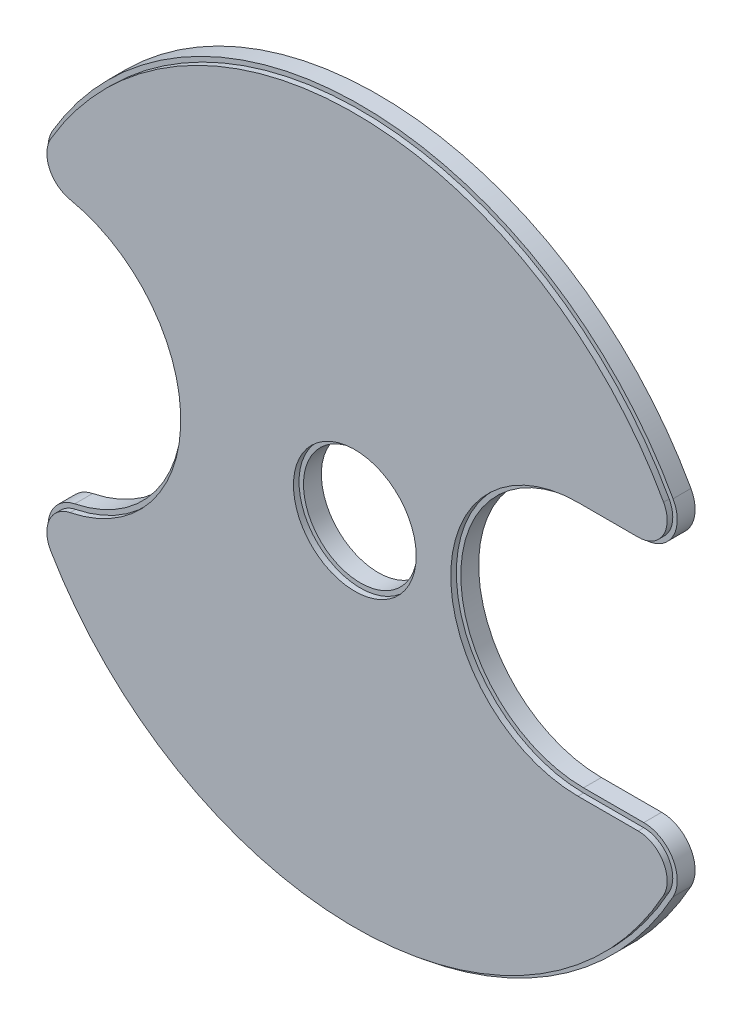
ISO-10303-21;
HEADER;
FILE_DESCRIPTION(('STEP AP214'),'2;1');
FILE_NAME('part.step','',(''),(''),'','','');
FILE_SCHEMA(('AUTOMOTIVE_DESIGN { 1 0 10303 214 1 1 1 1 }'));
ENDSEC;
DATA;
#1=APPLICATION_CONTEXT('core data for automotive mechanical design processes');
#2=APPLICATION_PROTOCOL_DEFINITION('international standard','automotive_design',2000,#1);
#3=PRODUCT_CONTEXT('',#1,'mechanical');
#4=PRODUCT('Part','Part','',(#3));
#5=PRODUCT_RELATED_PRODUCT_CATEGORY('part','',(#4));
#6=PRODUCT_DEFINITION_FORMATION('','',#4);
#7=PRODUCT_DEFINITION_CONTEXT('part definition',#1,'design');
#8=PRODUCT_DEFINITION('design','',#6,#7);
#9=PRODUCT_DEFINITION_SHAPE('','',#8);
#10=(LENGTH_UNIT() NAMED_UNIT(*) SI_UNIT(.MILLI.,.METRE.));
#11=(NAMED_UNIT(*) PLANE_ANGLE_UNIT() SI_UNIT($,.RADIAN.));
#12=(NAMED_UNIT(*) SI_UNIT($,.STERADIAN.) SOLID_ANGLE_UNIT());
#13=UNCERTAINTY_MEASURE_WITH_UNIT(LENGTH_MEASURE(1.E-05),#10,'distance_accuracy_value','');
#14=(GEOMETRIC_REPRESENTATION_CONTEXT(3) GLOBAL_UNCERTAINTY_ASSIGNED_CONTEXT((#13)) GLOBAL_UNIT_ASSIGNED_CONTEXT((#10,
#11,#12)) REPRESENTATION_CONTEXT('',''));
#15=CARTESIAN_POINT('',(0.,0.,0.));
#16=DIRECTION('',(0.,0.,1.));
#17=DIRECTION('',(1.,0.,0.));
#18=AXIS2_PLACEMENT_3D('',#15,#16,#17);
#19=CARTESIAN_POINT('',(0.,0.,1.6));
#20=DIRECTION('',(0.,0.,-1.));
#21=DIRECTION('',(-1.,0.,0.));
#22=AXIS2_PLACEMENT_3D('',#19,#20,#21);
#23=PLANE('',#22);
#24=CARTESIAN_POINT('',(0.,0.,1.6));
#25=DIRECTION('',(0.,0.,1.));
#26=DIRECTION('',(1.,0.,0.));
#27=AXIS2_PLACEMENT_3D('',#24,#25,#26);
#28=CIRCLE('',#27,5.1);
#29=CARTESIAN_POINT('',(5.1,0.,1.6));
#30=VERTEX_POINT('',#29);
#31=EDGE_CURVE('E199',#30,#30,#28,.T.);
#32=ORIENTED_EDGE('',*,*,#31,.F.);
#33=EDGE_LOOP('',(#32));
#34=FACE_BOUND('',#33,.T.);
#35=CARTESIAN_POINT('',(0.,0.,1.6));
#36=DIRECTION('',(0.,0.,1.));
#37=DIRECTION('',(1.,0.,0.));
#38=AXIS2_PLACEMENT_3D('',#35,#36,#37);
#39=CIRCLE('',#38,5.5);
#40=CARTESIAN_POINT('',(5.5,0.,1.6));
#41=VERTEX_POINT('',#40);
#42=EDGE_CURVE('E562',#41,#41,#39,.T.);
#43=ORIENTED_EDGE('',*,*,#42,.T.);
#44=EDGE_LOOP('',(#43));
#45=FACE_BOUND('',#44,.T.);
#46=ADVANCED_FACE('F39',(#34,#45),#23,.F.);
#47=CARTESIAN_POINT('',(20.,0.,1.6));
#48=DIRECTION('',(0.,0.,-1.));
#49=DIRECTION('',(1.,0.,0.));
#50=AXIS2_PLACEMENT_3D('',#47,#48,#49);
#51=CIRCLE('',#50,11.4);
#52=CARTESIAN_POINT('',(20.,-11.4,1.6));
#53=VERTEX_POINT('',#52);
#54=CARTESIAN_POINT('',(20.,11.4,1.6));
#55=VERTEX_POINT('',#54);
#56=EDGE_CURVE('E54',#53,#55,#51,.T.);
#57=ORIENTED_EDGE('',*,*,#56,.F.);
#58=DIRECTION('',(-1.,0.,0.));
#59=VECTOR('',#58,1.);
#60=CARTESIAN_POINT('',(25.3968501984006,-11.4,1.6));
#61=LINE('',#60,#59);
#62=CARTESIAN_POINT('',(25.3968501984006,-11.4,1.6));
#63=VERTEX_POINT('',#62);
#64=EDGE_CURVE('E58',#63,#53,#61,.T.);
#65=ORIENTED_EDGE('',*,*,#64,.F.);
#66=CARTESIAN_POINT('',(25.3968501984006,-14.,1.6));
#67=DIRECTION('',(0.,0.,1.));
#68=DIRECTION('',(1.,0.,0.));
#69=AXIS2_PLACEMENT_3D('',#66,#67,#68);
#70=CIRCLE('',#69,2.6);
#71=CARTESIAN_POINT('',(27.6738091817055,-15.2551724137931,1.6));
#72=VERTEX_POINT('',#71);
#73=EDGE_CURVE('E602',#72,#63,#70,.T.);
#74=ORIENTED_EDGE('',*,*,#73,.F.);
#75=CARTESIAN_POINT('',(0.,1.17961196366423E-13,1.6));
#76=DIRECTION('',(0.,0.,1.));
#77=DIRECTION('',(1.,0.,0.));
#78=AXIS2_PLACEMENT_3D('',#75,#76,#77);
#79=CIRCLE('',#78,31.6);
#80=CARTESIAN_POINT('',(-27.2413793103448,-16.0145950079893,1.6));
#81=VERTEX_POINT('',#80);
#82=EDGE_CURVE('E599',#81,#72,#79,.T.);
#83=ORIENTED_EDGE('',*,*,#82,.F.);
#84=CARTESIAN_POINT('',(-25.,-14.6969384566991,1.6));
#85=DIRECTION('',(0.,0.,1.));
#86=DIRECTION('',(1.,0.,0.));
#87=AXIS2_PLACEMENT_3D('',#84,#85,#86);
#88=CIRCLE('',#87,2.6);
#89=CARTESIAN_POINT('',(-25.52,-12.1494691242046,1.6));
#90=VERTEX_POINT('',#89);
#91=EDGE_CURVE('E596',#90,#81,#88,.T.);
#92=ORIENTED_EDGE('',*,*,#91,.F.);
#93=CARTESIAN_POINT('',(-28.,0.,1.6));
#94=DIRECTION('',(0.,0.,-1.));
#95=DIRECTION('',(1.,0.,0.));
#96=AXIS2_PLACEMENT_3D('',#93,#94,#95);
#97=CIRCLE('',#96,12.4);
#98=CARTESIAN_POINT('',(-25.52,12.1494691242046,1.6));
#99=VERTEX_POINT('',#98);
#100=EDGE_CURVE('E593',#99,#90,#97,.T.);
#101=ORIENTED_EDGE('',*,*,#100,.F.);
#102=CARTESIAN_POINT('',(-25.,14.6969384566991,1.6));
#103=DIRECTION('',(0.,0.,1.));
#104=DIRECTION('',(1.,0.,0.));
#105=AXIS2_PLACEMENT_3D('',#102,#103,#104);
#106=CIRCLE('',#105,2.6);
#107=CARTESIAN_POINT('',(-27.2413793103448,16.0145950079893,1.6));
#108=VERTEX_POINT('',#107);
#109=EDGE_CURVE('E590',#108,#99,#106,.T.);
#110=ORIENTED_EDGE('',*,*,#109,.F.);
#111=CARTESIAN_POINT('',(0.,0.,1.6));
#112=DIRECTION('',(0.,0.,1.));
#113=DIRECTION('',(1.,0.,0.));
#114=AXIS2_PLACEMENT_3D('',#111,#112,#113);
#115=CIRCLE('',#114,31.6);
#116=CARTESIAN_POINT('',(27.6738091817055,15.2551724137931,1.6));
#117=VERTEX_POINT('',#116);
#118=EDGE_CURVE('E587',#117,#108,#115,.T.);
#119=ORIENTED_EDGE('',*,*,#118,.F.);
#120=CARTESIAN_POINT('',(25.3968501984006,14.,1.6));
#121=DIRECTION('',(0.,0.,1.));
#122=DIRECTION('',(1.,0.,0.));
#123=AXIS2_PLACEMENT_3D('',#120,#121,#122);
#124=CIRCLE('',#123,2.6);
#125=CARTESIAN_POINT('',(25.3968501984006,11.4,1.6));
#126=VERTEX_POINT('',#125);
#127=EDGE_CURVE('E584',#126,#117,#124,.T.);
#128=ORIENTED_EDGE('',*,*,#127,.F.);
#129=DIRECTION('',(1.,0.,0.));
#130=VECTOR('',#129,1.);
#131=CARTESIAN_POINT('',(20.,11.4,1.6));
#132=LINE('',#131,#130);
#133=EDGE_CURVE('E582',#55,#126,#132,.T.);
#134=ORIENTED_EDGE('',*,*,#133,.F.);
#135=EDGE_LOOP('',(#57,#65,#74,#83,#92,#101,#110,#119,#128,#134));
#136=FACE_BOUND('',#135,.T.);
#137=CARTESIAN_POINT('',(-28.,0.,1.6));
#138=DIRECTION('',(0.,0.,-1.));
#139=DIRECTION('',(-1.,0.,0.));
#140=AXIS2_PLACEMENT_3D('',#137,#138,#139);
#141=CIRCLE('',#140,12.);
#142=CARTESIAN_POINT('',(-25.6,11.7575507653592,1.6));
#143=VERTEX_POINT('',#142);
#144=CARTESIAN_POINT('',(-25.6,-11.7575507653592,1.6));
#145=VERTEX_POINT('',#144);
#146=EDGE_CURVE('E211',#143,#145,#141,.T.);
#147=ORIENTED_EDGE('',*,*,#146,.T.);
#148=CARTESIAN_POINT('',(-25.,-14.6969384566991,1.6));
#149=DIRECTION('',(0.,0.,-1.));
#150=DIRECTION('',(-1.,0.,0.));
#151=AXIS2_PLACEMENT_3D('',#148,#149,#150);
#152=CIRCLE('',#151,3.);
#153=CARTESIAN_POINT('',(-27.5862068965517,-16.2173114004955,1.6));
#154=VERTEX_POINT('',#153);
#155=EDGE_CURVE('E269',#145,#154,#152,.F.);
#156=ORIENTED_EDGE('',*,*,#155,.T.);
#157=CARTESIAN_POINT('',(0.,1.17961196366423E-13,1.6));
#158=DIRECTION('',(0.,0.,1.));
#159=DIRECTION('',(1.,0.,0.));
#160=AXIS2_PLACEMENT_3D('',#157,#158,#159);
#161=CIRCLE('',#160,32.);
#162=CARTESIAN_POINT('',(28.0241105637524,-15.448275862069,1.6));
#163=VERTEX_POINT('',#162);
#164=EDGE_CURVE('E215',#154,#163,#161,.T.);
#165=ORIENTED_EDGE('',*,*,#164,.T.);
#166=CARTESIAN_POINT('',(25.3968501984006,-14.,1.6));
#167=DIRECTION('',(0.,0.,-1.));
#168=DIRECTION('',(-1.,0.,0.));
#169=AXIS2_PLACEMENT_3D('',#166,#167,#168);
#170=CIRCLE('',#169,3.);
#171=CARTESIAN_POINT('',(25.3968501984006,-11.,1.6));
#172=VERTEX_POINT('',#171);
#173=EDGE_CURVE('E265',#163,#172,#170,.F.);
#174=ORIENTED_EDGE('',*,*,#173,.T.);
#175=DIRECTION('',(-1.,0.,0.));
#176=VECTOR('',#175,1.);
#177=CARTESIAN_POINT('',(30.0499584026334,-11.,1.6));
#178=LINE('',#177,#176);
#179=CARTESIAN_POINT('',(20.,-11.,1.6));
#180=VERTEX_POINT('',#179);
#181=EDGE_CURVE('E218',#172,#180,#178,.T.);
#182=ORIENTED_EDGE('',*,*,#181,.T.);
#183=CARTESIAN_POINT('',(20.,0.,1.6));
#184=DIRECTION('',(0.,0.,-1.));
#185=DIRECTION('',(1.,0.,0.));
#186=AXIS2_PLACEMENT_3D('',#183,#184,#185);
#187=CIRCLE('',#186,11.);
#188=CARTESIAN_POINT('',(20.,11.,1.6));
#189=VERTEX_POINT('',#188);
#190=EDGE_CURVE('E220',#180,#189,#187,.T.);
#191=ORIENTED_EDGE('',*,*,#190,.T.);
#192=DIRECTION('',(1.,0.,0.));
#193=VECTOR('',#192,1.);
#194=CARTESIAN_POINT('',(30.0499584026334,11.,1.6));
#195=LINE('',#194,#193);
#196=CARTESIAN_POINT('',(25.3968501984006,11.,1.6));
#197=VERTEX_POINT('',#196);
#198=EDGE_CURVE('E222',#189,#197,#195,.T.);
#199=ORIENTED_EDGE('',*,*,#198,.T.);
#200=CARTESIAN_POINT('',(25.3968501984006,14.,1.6));
#201=DIRECTION('',(0.,0.,-1.));
#202=DIRECTION('',(-1.,0.,0.));
#203=AXIS2_PLACEMENT_3D('',#200,#201,#202);
#204=CIRCLE('',#203,3.);
#205=CARTESIAN_POINT('',(28.0241105637524,15.448275862069,1.6));
#206=VERTEX_POINT('',#205);
#207=EDGE_CURVE('E263',#197,#206,#204,.F.);
#208=ORIENTED_EDGE('',*,*,#207,.T.);
#209=CARTESIAN_POINT('',(0.,0.,1.6));
#210=DIRECTION('',(0.,0.,1.));
#211=DIRECTION('',(-1.,0.,0.));
#212=AXIS2_PLACEMENT_3D('',#209,#210,#211);
#213=CIRCLE('',#212,32.);
#214=CARTESIAN_POINT('',(-27.5862068965517,16.2173114004955,1.6));
#215=VERTEX_POINT('',#214);
#216=EDGE_CURVE('E208',#206,#215,#213,.T.);
#217=ORIENTED_EDGE('',*,*,#216,.T.);
#218=CARTESIAN_POINT('',(-25.,14.6969384566991,1.6));
#219=DIRECTION('',(0.,0.,-1.));
#220=DIRECTION('',(-1.,0.,0.));
#221=AXIS2_PLACEMENT_3D('',#218,#219,#220);
#222=CIRCLE('',#221,3.);
#223=EDGE_CURVE('E267',#215,#143,#222,.F.);
#224=ORIENTED_EDGE('',*,*,#223,.T.);
#225=EDGE_LOOP('',(#147,#156,#165,#174,#182,#191,#199,#208,#217,#224));
#226=FACE_BOUND('',#225,.T.);
#227=ADVANCED_FACE('F300',(#136,#226),#23,.F.);
#228=CARTESIAN_POINT('',(0.,0.,0.));
#229=DIRECTION('',(0.,0.,-1.));
#230=DIRECTION('',(-1.,0.,0.));
#231=AXIS2_PLACEMENT_3D('',#228,#229,#230);
#232=PLANE('',#231);
#233=CARTESIAN_POINT('',(0.,1.17961196366423E-13,0.));
#234=DIRECTION('',(0.,0.,1.));
#235=DIRECTION('',(1.,0.,0.));
#236=AXIS2_PLACEMENT_3D('',#233,#234,#235);
#237=CIRCLE('',#236,32.);
#238=CARTESIAN_POINT('',(-27.5862068965517,-16.2173114004955,0.));
#239=VERTEX_POINT('',#238);
#240=CARTESIAN_POINT('',(28.0241105637524,-15.448275862069,0.));
#241=VERTEX_POINT('',#240);
#242=EDGE_CURVE('E231',#239,#241,#237,.T.);
#243=ORIENTED_EDGE('',*,*,#242,.F.);
#244=CARTESIAN_POINT('',(-25.,-14.6969384566991,0.));
#245=DIRECTION('',(0.,0.,-1.));
#246=DIRECTION('',(-1.,0.,0.));
#247=AXIS2_PLACEMENT_3D('',#244,#245,#246);
#248=CIRCLE('',#247,3.);
#249=CARTESIAN_POINT('',(-25.6,-11.7575507653592,0.));
#250=VERTEX_POINT('',#249);
#251=EDGE_CURVE('E256',#239,#250,#248,.T.);
#252=ORIENTED_EDGE('',*,*,#251,.T.);
#253=CARTESIAN_POINT('',(-28.,0.,0.));
#254=DIRECTION('',(0.,0.,-1.));
#255=DIRECTION('',(-1.,0.,0.));
#256=AXIS2_PLACEMENT_3D('',#253,#254,#255);
#257=CIRCLE('',#256,12.);
#258=CARTESIAN_POINT('',(-25.6,11.7575507653592,0.));
#259=VERTEX_POINT('',#258);
#260=EDGE_CURVE('E228',#259,#250,#257,.T.);
#261=ORIENTED_EDGE('',*,*,#260,.F.);
#262=CARTESIAN_POINT('',(-25.,14.6969384566991,0.));
#263=DIRECTION('',(0.,0.,-1.));
#264=DIRECTION('',(-1.,0.,0.));
#265=AXIS2_PLACEMENT_3D('',#262,#263,#264);
#266=CIRCLE('',#265,3.);
#267=CARTESIAN_POINT('',(-27.5862068965517,16.2173114004955,0.));
#268=VERTEX_POINT('',#267);
#269=EDGE_CURVE('E254',#259,#268,#266,.T.);
#270=ORIENTED_EDGE('',*,*,#269,.T.);
#271=CARTESIAN_POINT('',(0.,0.,0.));
#272=DIRECTION('',(0.,0.,1.));
#273=DIRECTION('',(-1.,0.,0.));
#274=AXIS2_PLACEMENT_3D('',#271,#272,#273);
#275=CIRCLE('',#274,32.);
#276=CARTESIAN_POINT('',(28.0241105637524,15.448275862069,0.));
#277=VERTEX_POINT('',#276);
#278=EDGE_CURVE('E206',#277,#268,#275,.T.);
#279=ORIENTED_EDGE('',*,*,#278,.F.);
#280=CARTESIAN_POINT('',(25.3968501984006,14.,0.));
#281=DIRECTION('',(0.,0.,-1.));
#282=DIRECTION('',(-1.,0.,0.));
#283=AXIS2_PLACEMENT_3D('',#280,#281,#282);
#284=CIRCLE('',#283,3.);
#285=CARTESIAN_POINT('',(25.3968501984006,11.,0.));
#286=VERTEX_POINT('',#285);
#287=EDGE_CURVE('E250',#277,#286,#284,.T.);
#288=ORIENTED_EDGE('',*,*,#287,.T.);
#289=DIRECTION('',(1.,0.,0.));
#290=VECTOR('',#289,1.);
#291=CARTESIAN_POINT('',(30.0499584026334,11.,0.));
#292=LINE('',#291,#290);
#293=CARTESIAN_POINT('',(20.,11.,0.));
#294=VERTEX_POINT('',#293);
#295=EDGE_CURVE('E212',#294,#286,#292,.T.);
#296=ORIENTED_EDGE('',*,*,#295,.F.);
#297=CARTESIAN_POINT('',(20.,0.,0.));
#298=DIRECTION('',(0.,0.,-1.));
#299=DIRECTION('',(1.,0.,0.));
#300=AXIS2_PLACEMENT_3D('',#297,#298,#299);
#301=CIRCLE('',#300,11.);
#302=CARTESIAN_POINT('',(20.,-11.,0.));
#303=VERTEX_POINT('',#302);
#304=EDGE_CURVE('E236',#303,#294,#301,.T.);
#305=ORIENTED_EDGE('',*,*,#304,.F.);
#306=DIRECTION('',(-1.,0.,0.));
#307=VECTOR('',#306,1.);
#308=CARTESIAN_POINT('',(30.0499584026334,-11.,0.));
#309=LINE('',#308,#307);
#310=CARTESIAN_POINT('',(25.3968501984006,-11.,0.));
#311=VERTEX_POINT('',#310);
#312=EDGE_CURVE('E234',#311,#303,#309,.T.);
#313=ORIENTED_EDGE('',*,*,#312,.F.);
#314=CARTESIAN_POINT('',(25.3968501984006,-14.,0.));
#315=DIRECTION('',(0.,0.,-1.));
#316=DIRECTION('',(-1.,0.,0.));
#317=AXIS2_PLACEMENT_3D('',#314,#315,#316);
#318=CIRCLE('',#317,3.);
#319=EDGE_CURVE('E252',#311,#241,#318,.T.);
#320=ORIENTED_EDGE('',*,*,#319,.T.);
#321=EDGE_LOOP('',(#243,#252,#261,#270,#279,#288,#296,#305,#313,#320));
#322=FACE_BOUND('',#321,.T.);
#323=CARTESIAN_POINT('',(0.,0.,0.));
#324=DIRECTION('',(0.,0.,1.));
#325=DIRECTION('',(1.,0.,0.));
#326=AXIS2_PLACEMENT_3D('',#323,#324,#325);
#327=CIRCLE('',#326,5.1);
#328=CARTESIAN_POINT('',(5.1,0.,0.));
#329=VERTEX_POINT('',#328);
#330=EDGE_CURVE('E196',#329,#329,#327,.T.);
#331=ORIENTED_EDGE('',*,*,#330,.T.);
#332=EDGE_LOOP('',(#331));
#333=FACE_BOUND('',#332,.T.);
#334=ADVANCED_FACE('F287',(#322,#333),#232,.T.);
#335=CARTESIAN_POINT('',(0.,0.,1.6));
#336=DIRECTION('',(0.,0.,-1.));
#337=DIRECTION('',(-1.,0.,0.));
#338=AXIS2_PLACEMENT_3D('',#335,#336,#337);
#339=CYLINDRICAL_SURFACE('',#338,32.);
#340=ORIENTED_EDGE('',*,*,#278,.T.);
#341=DIRECTION('',(0.,0.,-1.));
#342=VECTOR('',#341,1.);
#343=CARTESIAN_POINT('',(-27.5862068965517,16.2173114004955,1.6));
#344=LINE('',#343,#342);
#345=EDGE_CURVE('E274',#268,#215,#344,.F.);
#346=ORIENTED_EDGE('',*,*,#345,.T.);
#347=ORIENTED_EDGE('',*,*,#216,.F.);
#348=DIRECTION('',(0.,0.,-1.));
#349=VECTOR('',#348,1.);
#350=CARTESIAN_POINT('',(28.0241105637524,15.448275862069,1.6));
#351=LINE('',#350,#349);
#352=EDGE_CURVE('E271',#206,#277,#351,.T.);
#353=ORIENTED_EDGE('',*,*,#352,.T.);
#354=EDGE_LOOP('',(#340,#346,#347,#353));
#355=FACE_BOUND('',#354,.T.);
#356=ADVANCED_FACE('F306',(#355),#339,.T.);
#357=CARTESIAN_POINT('',(-28.,0.,1.6));
#358=DIRECTION('',(0.,0.,-1.));
#359=DIRECTION('',(-1.,0.,0.));
#360=AXIS2_PLACEMENT_3D('',#357,#358,#359);
#361=CYLINDRICAL_SURFACE('',#360,12.);
#362=ORIENTED_EDGE('',*,*,#260,.T.);
#363=DIRECTION('',(0.,0.,-1.));
#364=VECTOR('',#363,1.);
#365=CARTESIAN_POINT('',(-25.6,-11.7575507653592,1.6));
#366=LINE('',#365,#364);
#367=EDGE_CURVE('E261',#250,#145,#366,.F.);
#368=ORIENTED_EDGE('',*,*,#367,.T.);
#369=ORIENTED_EDGE('',*,*,#146,.F.);
#370=DIRECTION('',(0.,0.,-1.));
#371=VECTOR('',#370,1.);
#372=CARTESIAN_POINT('',(-25.6,11.7575507653592,1.6));
#373=LINE('',#372,#371);
#374=EDGE_CURVE('E258',#143,#259,#373,.T.);
#375=ORIENTED_EDGE('',*,*,#374,.T.);
#376=EDGE_LOOP('',(#362,#368,#369,#375));
#377=FACE_BOUND('',#376,.T.);
#378=ADVANCED_FACE('F315',(#377),#361,.F.);
#379=CARTESIAN_POINT('',(0.,1.17961196366423E-13,1.6));
#380=DIRECTION('',(0.,0.,-1.));
#381=DIRECTION('',(-1.,0.,0.));
#382=AXIS2_PLACEMENT_3D('',#379,#380,#381);
#383=CYLINDRICAL_SURFACE('',#382,32.);
#384=ORIENTED_EDGE('',*,*,#164,.F.);
#385=DIRECTION('',(0.,0.,-1.));
#386=VECTOR('',#385,1.);
#387=CARTESIAN_POINT('',(-27.5862068965517,-16.2173114004955,1.6));
#388=LINE('',#387,#386);
#389=EDGE_CURVE('E247',#154,#239,#388,.T.);
#390=ORIENTED_EDGE('',*,*,#389,.T.);
#391=ORIENTED_EDGE('',*,*,#242,.T.);
#392=DIRECTION('',(0.,0.,-1.));
#393=VECTOR('',#392,1.);
#394=CARTESIAN_POINT('',(28.0241105637524,-15.448275862069,1.6));
#395=LINE('',#394,#393);
#396=EDGE_CURVE('E245',#241,#163,#395,.F.);
#397=ORIENTED_EDGE('',*,*,#396,.T.);
#398=EDGE_LOOP('',(#384,#390,#391,#397));
#399=FACE_BOUND('',#398,.T.);
#400=ADVANCED_FACE('F323',(#399),#383,.T.);
#401=CARTESIAN_POINT('',(30.0499584026334,-11.,1.6));
#402=DIRECTION('',(0.,-1.,0.));
#403=DIRECTION('',(1.,0.,0.));
#404=AXIS2_PLACEMENT_3D('',#401,#402,#403);
#405=PLANE('',#404);
#406=ORIENTED_EDGE('',*,*,#181,.F.);
#407=DIRECTION('',(0.,0.,-1.));
#408=VECTOR('',#407,1.);
#409=CARTESIAN_POINT('',(25.3968501984006,-11.,1.6));
#410=LINE('',#409,#408);
#411=EDGE_CURVE('E47',#172,#311,#410,.T.);
#412=ORIENTED_EDGE('',*,*,#411,.T.);
#413=ORIENTED_EDGE('',*,*,#312,.T.);
#414=DIRECTION('',(0.,0.,-1.));
#415=VECTOR('',#414,1.);
#416=CARTESIAN_POINT('',(20.,-11.,1.6));
#417=LINE('',#416,#415);
#418=EDGE_CURVE('E242',#180,#303,#417,.T.);
#419=ORIENTED_EDGE('',*,*,#418,.F.);
#420=EDGE_LOOP('',(#406,#412,#413,#419));
#421=FACE_BOUND('',#420,.T.);
#422=ADVANCED_FACE('F280',(#421),#405,.F.);
#423=CARTESIAN_POINT('',(20.,0.,1.6));
#424=DIRECTION('',(0.,0.,-1.));
#425=DIRECTION('',(-1.,0.,0.));
#426=AXIS2_PLACEMENT_3D('',#423,#424,#425);
#427=CYLINDRICAL_SURFACE('',#426,11.);
#428=ORIENTED_EDGE('',*,*,#304,.T.);
#429=DIRECTION('',(0.,0.,-1.));
#430=VECTOR('',#429,1.);
#431=CARTESIAN_POINT('',(20.,11.,1.6));
#432=LINE('',#431,#430);
#433=EDGE_CURVE('E225',#189,#294,#432,.T.);
#434=ORIENTED_EDGE('',*,*,#433,.F.);
#435=ORIENTED_EDGE('',*,*,#190,.F.);
#436=ORIENTED_EDGE('',*,*,#418,.T.);
#437=EDGE_LOOP('',(#428,#434,#435,#436));
#438=FACE_BOUND('',#437,.T.);
#439=ADVANCED_FACE('F292',(#438),#427,.F.);
#440=CARTESIAN_POINT('',(30.0499584026334,11.,1.6));
#441=DIRECTION('',(0.,1.,0.));
#442=DIRECTION('',(-1.,0.,0.));
#443=AXIS2_PLACEMENT_3D('',#440,#441,#442);
#444=PLANE('',#443);
#445=ORIENTED_EDGE('',*,*,#295,.T.);
#446=DIRECTION('',(0.,0.,-1.));
#447=VECTOR('',#446,1.);
#448=CARTESIAN_POINT('',(25.3968501984006,11.,1.6));
#449=LINE('',#448,#447);
#450=EDGE_CURVE('E11',#286,#197,#449,.F.);
#451=ORIENTED_EDGE('',*,*,#450,.T.);
#452=ORIENTED_EDGE('',*,*,#198,.F.);
#453=ORIENTED_EDGE('',*,*,#433,.T.);
#454=EDGE_LOOP('',(#445,#451,#452,#453));
#455=FACE_BOUND('',#454,.T.);
#456=ADVANCED_FACE('F296',(#455),#444,.F.);
#457=CARTESIAN_POINT('',(0.,0.,1.6));
#458=DIRECTION('',(0.,0.,-1.));
#459=DIRECTION('',(-1.,0.,0.));
#460=AXIS2_PLACEMENT_3D('',#457,#458,#459);
#461=CYLINDRICAL_SURFACE('',#460,5.1);
#462=ORIENTED_EDGE('',*,*,#31,.T.);
#463=EDGE_LOOP('',(#462));
#464=FACE_BOUND('',#463,.T.);
#465=ORIENTED_EDGE('',*,*,#330,.F.);
#466=EDGE_LOOP('',(#465));
#467=FACE_BOUND('',#466,.T.);
#468=ADVANCED_FACE('F342',(#464,#467),#461,.F.);
#469=CARTESIAN_POINT('',(-25.,-14.6969384566991,1.6));
#470=DIRECTION('',(0.,0.,1.));
#471=DIRECTION('',(1.,0.,0.));
#472=AXIS2_PLACEMENT_3D('',#469,#470,#471);
#473=CYLINDRICAL_SURFACE('',#472,3.);
#474=ORIENTED_EDGE('',*,*,#155,.F.);
#475=ORIENTED_EDGE('',*,*,#367,.F.);
#476=ORIENTED_EDGE('',*,*,#251,.F.);
#477=ORIENTED_EDGE('',*,*,#389,.F.);
#478=EDGE_LOOP('',(#474,#475,#476,#477));
#479=FACE_BOUND('',#478,.T.);
#480=ADVANCED_FACE('F321',(#479),#473,.T.);
#481=CARTESIAN_POINT('',(-25.,14.6969384566991,1.6));
#482=DIRECTION('',(0.,0.,1.));
#483=DIRECTION('',(1.,0.,0.));
#484=AXIS2_PLACEMENT_3D('',#481,#482,#483);
#485=CYLINDRICAL_SURFACE('',#484,3.);
#486=ORIENTED_EDGE('',*,*,#223,.F.);
#487=ORIENTED_EDGE('',*,*,#345,.F.);
#488=ORIENTED_EDGE('',*,*,#269,.F.);
#489=ORIENTED_EDGE('',*,*,#374,.F.);
#490=EDGE_LOOP('',(#486,#487,#488,#489));
#491=FACE_BOUND('',#490,.T.);
#492=ADVANCED_FACE('F312',(#491),#485,.T.);
#493=CARTESIAN_POINT('',(25.3968501984006,-14.,1.6));
#494=DIRECTION('',(0.,0.,-1.));
#495=DIRECTION('',(-1.,0.,0.));
#496=AXIS2_PLACEMENT_3D('',#493,#494,#495);
#497=CYLINDRICAL_SURFACE('',#496,3.);
#498=ORIENTED_EDGE('',*,*,#173,.F.);
#499=ORIENTED_EDGE('',*,*,#396,.F.);
#500=ORIENTED_EDGE('',*,*,#319,.F.);
#501=ORIENTED_EDGE('',*,*,#411,.F.);
#502=EDGE_LOOP('',(#498,#499,#500,#501));
#503=FACE_BOUND('',#502,.T.);
#504=ADVANCED_FACE('F325',(#503),#497,.T.);
#505=CARTESIAN_POINT('',(25.3968501984006,14.,1.6));
#506=DIRECTION('',(0.,0.,-1.));
#507=DIRECTION('',(-1.,0.,0.));
#508=AXIS2_PLACEMENT_3D('',#505,#506,#507);
#509=CYLINDRICAL_SURFACE('',#508,3.);
#510=ORIENTED_EDGE('',*,*,#207,.F.);
#511=ORIENTED_EDGE('',*,*,#450,.F.);
#512=ORIENTED_EDGE('',*,*,#287,.F.);
#513=ORIENTED_EDGE('',*,*,#352,.F.);
#514=EDGE_LOOP('',(#510,#511,#512,#513));
#515=FACE_BOUND('',#514,.T.);
#516=ADVANCED_FACE('F41',(#515),#509,.T.);
#517=CARTESIAN_POINT('',(20.,0.,2.1));
#518=DIRECTION('',(0.,0.,1.));
#519=DIRECTION('',(1.,0.,0.));
#520=AXIS2_PLACEMENT_3D('',#517,#518,#519);
#521=PLANE('',#520);
#522=CARTESIAN_POINT('',(20.,0.,2.1));
#523=DIRECTION('',(0.,0.,-1.));
#524=DIRECTION('',(1.,0.,0.));
#525=AXIS2_PLACEMENT_3D('',#522,#523,#524);
#526=CIRCLE('',#525,11.4);
#527=CARTESIAN_POINT('',(20.,-11.4,2.1));
#528=VERTEX_POINT('',#527);
#529=CARTESIAN_POINT('',(20.,11.4,2.1));
#530=VERTEX_POINT('',#529);
#531=EDGE_CURVE('E184',#528,#530,#526,.T.);
#532=ORIENTED_EDGE('',*,*,#531,.T.);
#533=DIRECTION('',(1.,0.,0.));
#534=VECTOR('',#533,1.);
#535=CARTESIAN_POINT('',(20.,11.4,2.1));
#536=LINE('',#535,#534);
#537=CARTESIAN_POINT('',(25.3968501984006,11.4,2.1));
#538=VERTEX_POINT('',#537);
#539=EDGE_CURVE('E173',#530,#538,#536,.T.);
#540=ORIENTED_EDGE('',*,*,#539,.T.);
#541=CARTESIAN_POINT('',(25.3968501984006,14.,2.1));
#542=DIRECTION('',(0.,0.,1.));
#543=DIRECTION('',(1.,0.,0.));
#544=AXIS2_PLACEMENT_3D('',#541,#542,#543);
#545=CIRCLE('',#544,2.6);
#546=CARTESIAN_POINT('',(27.6738091817055,15.2551724137931,2.1));
#547=VERTEX_POINT('',#546);
#548=EDGE_CURVE('E183',#538,#547,#545,.T.);
#549=ORIENTED_EDGE('',*,*,#548,.T.);
#550=CARTESIAN_POINT('',(0.,0.,2.1));
#551=DIRECTION('',(0.,0.,1.));
#552=DIRECTION('',(1.,0.,0.));
#553=AXIS2_PLACEMENT_3D('',#550,#551,#552);
#554=CIRCLE('',#553,31.6);
#555=CARTESIAN_POINT('',(-27.2413793103448,16.0145950079893,2.1));
#556=VERTEX_POINT('',#555);
#557=EDGE_CURVE('E567',#547,#556,#554,.T.);
#558=ORIENTED_EDGE('',*,*,#557,.T.);
#559=CARTESIAN_POINT('',(-25.,14.6969384566991,2.1));
#560=DIRECTION('',(0.,0.,1.));
#561=DIRECTION('',(1.,0.,0.));
#562=AXIS2_PLACEMENT_3D('',#559,#560,#561);
#563=CIRCLE('',#562,2.6);
#564=CARTESIAN_POINT('',(-25.52,12.1494691242046,2.1));
#565=VERTEX_POINT('',#564);
#566=EDGE_CURVE('E569',#556,#565,#563,.T.);
#567=ORIENTED_EDGE('',*,*,#566,.T.);
#568=CARTESIAN_POINT('',(-28.,0.,2.1));
#569=DIRECTION('',(0.,0.,-1.));
#570=DIRECTION('',(1.,0.,0.));
#571=AXIS2_PLACEMENT_3D('',#568,#569,#570);
#572=CIRCLE('',#571,12.4);
#573=CARTESIAN_POINT('',(-25.52,-12.1494691242046,2.1));
#574=VERTEX_POINT('',#573);
#575=EDGE_CURVE('E571',#565,#574,#572,.T.);
#576=ORIENTED_EDGE('',*,*,#575,.T.);
#577=CARTESIAN_POINT('',(-25.,-14.6969384566991,2.1));
#578=DIRECTION('',(0.,0.,1.));
#579=DIRECTION('',(1.,0.,0.));
#580=AXIS2_PLACEMENT_3D('',#577,#578,#579);
#581=CIRCLE('',#580,2.6);
#582=CARTESIAN_POINT('',(-27.2413793103448,-16.0145950079893,2.1));
#583=VERTEX_POINT('',#582);
#584=EDGE_CURVE('E573',#574,#583,#581,.T.);
#585=ORIENTED_EDGE('',*,*,#584,.T.);
#586=CARTESIAN_POINT('',(0.,1.17961196366423E-13,2.1));
#587=DIRECTION('',(0.,0.,1.));
#588=DIRECTION('',(1.,0.,0.));
#589=AXIS2_PLACEMENT_3D('',#586,#587,#588);
#590=CIRCLE('',#589,31.6);
#591=CARTESIAN_POINT('',(27.6738091817055,-15.2551724137931,2.1));
#592=VERTEX_POINT('',#591);
#593=EDGE_CURVE('E575',#583,#592,#590,.T.);
#594=ORIENTED_EDGE('',*,*,#593,.T.);
#595=CARTESIAN_POINT('',(25.3968501984006,-14.,2.1));
#596=DIRECTION('',(0.,0.,1.));
#597=DIRECTION('',(1.,0.,0.));
#598=AXIS2_PLACEMENT_3D('',#595,#596,#597);
#599=CIRCLE('',#598,2.6);
#600=CARTESIAN_POINT('',(25.3968501984006,-11.4,2.1));
#601=VERTEX_POINT('',#600);
#602=EDGE_CURVE('E577',#592,#601,#599,.T.);
#603=ORIENTED_EDGE('',*,*,#602,.T.);
#604=DIRECTION('',(-1.,0.,0.));
#605=VECTOR('',#604,1.);
#606=CARTESIAN_POINT('',(25.3968501984006,-11.4,2.1));
#607=LINE('',#606,#605);
#608=EDGE_CURVE('E190',#601,#528,#607,.T.);
#609=ORIENTED_EDGE('',*,*,#608,.T.);
#610=EDGE_LOOP('',(#532,#540,#549,#558,#567,#576,#585,#594,#603,#609));
#611=FACE_BOUND('',#610,.T.);
#612=CARTESIAN_POINT('',(0.,0.,2.1));
#613=DIRECTION('',(0.,0.,1.));
#614=DIRECTION('',(1.,0.,0.));
#615=AXIS2_PLACEMENT_3D('',#612,#613,#614);
#616=CIRCLE('',#615,5.5);
#617=CARTESIAN_POINT('',(5.5,0.,2.1));
#618=VERTEX_POINT('',#617);
#619=EDGE_CURVE('E559',#618,#618,#616,.T.);
#620=ORIENTED_EDGE('',*,*,#619,.F.);
#621=EDGE_LOOP('',(#620));
#622=FACE_BOUND('',#621,.T.);
#623=ADVANCED_FACE('F187',(#611,#622),#521,.T.);
#624=CARTESIAN_POINT('',(20.,0.,2.1));
#625=DIRECTION('',(0.,0.,-1.));
#626=DIRECTION('',(-1.,0.,0.));
#627=AXIS2_PLACEMENT_3D('',#624,#625,#626);
#628=CYLINDRICAL_SURFACE('',#627,11.4);
#629=ORIENTED_EDGE('',*,*,#56,.T.);
#630=DIRECTION('',(0.,0.,-1.));
#631=VECTOR('',#630,1.);
#632=CARTESIAN_POINT('',(20.,11.4,2.1));
#633=LINE('',#632,#631);
#634=EDGE_CURVE('E178',#530,#55,#633,.T.);
#635=ORIENTED_EDGE('',*,*,#634,.F.);
#636=ORIENTED_EDGE('',*,*,#531,.F.);
#637=DIRECTION('',(0.,0.,-1.));
#638=VECTOR('',#637,1.);
#639=CARTESIAN_POINT('',(20.,-11.4,2.1));
#640=LINE('',#639,#638);
#641=EDGE_CURVE('E580',#528,#53,#640,.T.);
#642=ORIENTED_EDGE('',*,*,#641,.T.);
#643=EDGE_LOOP('',(#629,#635,#636,#642));
#644=FACE_BOUND('',#643,.T.);
#645=ADVANCED_FACE('F195',(#644),#628,.F.);
#646=CARTESIAN_POINT('',(20.,11.4,2.1));
#647=DIRECTION('',(0.,1.,0.));
#648=DIRECTION('',(-1.,0.,0.));
#649=AXIS2_PLACEMENT_3D('',#646,#647,#648);
#650=PLANE('',#649);
#651=ORIENTED_EDGE('',*,*,#133,.T.);
#652=DIRECTION('',(0.,0.,-1.));
#653=VECTOR('',#652,1.);
#654=CARTESIAN_POINT('',(25.3968501984006,11.4,2.1));
#655=LINE('',#654,#653);
#656=EDGE_CURVE('E180',#538,#126,#655,.T.);
#657=ORIENTED_EDGE('',*,*,#656,.F.);
#658=ORIENTED_EDGE('',*,*,#539,.F.);
#659=ORIENTED_EDGE('',*,*,#634,.T.);
#660=EDGE_LOOP('',(#651,#657,#658,#659));
#661=FACE_BOUND('',#660,.T.);
#662=ADVANCED_FACE('F176',(#661),#650,.F.);
#663=CARTESIAN_POINT('',(25.3968501984006,14.,2.1));
#664=DIRECTION('',(0.,0.,-1.));
#665=DIRECTION('',(-1.,0.,0.));
#666=AXIS2_PLACEMENT_3D('',#663,#664,#665);
#667=CYLINDRICAL_SURFACE('',#666,2.6);
#668=ORIENTED_EDGE('',*,*,#127,.T.);
#669=DIRECTION('',(0.,0.,-1.));
#670=VECTOR('',#669,1.);
#671=CARTESIAN_POINT('',(27.6738091817055,15.2551724137931,2.1));
#672=LINE('',#671,#670);
#673=EDGE_CURVE('E201',#547,#117,#672,.T.);
#674=ORIENTED_EDGE('',*,*,#673,.F.);
#675=ORIENTED_EDGE('',*,*,#548,.F.);
#676=ORIENTED_EDGE('',*,*,#656,.T.);
#677=EDGE_LOOP('',(#668,#674,#675,#676));
#678=FACE_BOUND('',#677,.T.);
#679=ADVANCED_FACE('F436',(#678),#667,.T.);
#680=CARTESIAN_POINT('',(0.,0.,2.1));
#681=DIRECTION('',(0.,0.,-1.));
#682=DIRECTION('',(-1.,0.,0.));
#683=AXIS2_PLACEMENT_3D('',#680,#681,#682);
#684=CYLINDRICAL_SURFACE('',#683,31.6);
#685=ORIENTED_EDGE('',*,*,#118,.T.);
#686=DIRECTION('',(0.,0.,-1.));
#687=VECTOR('',#686,1.);
#688=CARTESIAN_POINT('',(-27.2413793103448,16.0145950079893,2.1));
#689=LINE('',#688,#687);
#690=EDGE_CURVE('E621',#556,#108,#689,.T.);
#691=ORIENTED_EDGE('',*,*,#690,.F.);
#692=ORIENTED_EDGE('',*,*,#557,.F.);
#693=ORIENTED_EDGE('',*,*,#673,.T.);
#694=EDGE_LOOP('',(#685,#691,#692,#693));
#695=FACE_BOUND('',#694,.T.);
#696=ADVANCED_FACE('F444',(#695),#684,.T.);
#697=CARTESIAN_POINT('',(-25.,14.6969384566991,2.1));
#698=DIRECTION('',(0.,0.,-1.));
#699=DIRECTION('',(-1.,0.,0.));
#700=AXIS2_PLACEMENT_3D('',#697,#698,#699);
#701=CYLINDRICAL_SURFACE('',#700,2.6);
#702=ORIENTED_EDGE('',*,*,#109,.T.);
#703=DIRECTION('',(0.,0.,-1.));
#704=VECTOR('',#703,1.);
#705=CARTESIAN_POINT('',(-25.52,12.1494691242046,2.1));
#706=LINE('',#705,#704);
#707=EDGE_CURVE('E618',#565,#99,#706,.T.);
#708=ORIENTED_EDGE('',*,*,#707,.F.);
#709=ORIENTED_EDGE('',*,*,#566,.F.);
#710=ORIENTED_EDGE('',*,*,#690,.T.);
#711=EDGE_LOOP('',(#702,#708,#709,#710));
#712=FACE_BOUND('',#711,.T.);
#713=ADVANCED_FACE('F453',(#712),#701,.T.);
#714=CARTESIAN_POINT('',(-28.,0.,2.1));
#715=DIRECTION('',(0.,0.,-1.));
#716=DIRECTION('',(-1.,0.,0.));
#717=AXIS2_PLACEMENT_3D('',#714,#715,#716);
#718=CYLINDRICAL_SURFACE('',#717,12.4);
#719=ORIENTED_EDGE('',*,*,#100,.T.);
#720=DIRECTION('',(0.,0.,-1.));
#721=VECTOR('',#720,1.);
#722=CARTESIAN_POINT('',(-25.52,-12.1494691242046,2.1));
#723=LINE('',#722,#721);
#724=EDGE_CURVE('E615',#574,#90,#723,.T.);
#725=ORIENTED_EDGE('',*,*,#724,.F.);
#726=ORIENTED_EDGE('',*,*,#575,.F.);
#727=ORIENTED_EDGE('',*,*,#707,.T.);
#728=EDGE_LOOP('',(#719,#725,#726,#727));
#729=FACE_BOUND('',#728,.T.);
#730=ADVANCED_FACE('F462',(#729),#718,.F.);
#731=CARTESIAN_POINT('',(-25.,-14.6969384566991,2.1));
#732=DIRECTION('',(0.,0.,-1.));
#733=DIRECTION('',(-1.,0.,0.));
#734=AXIS2_PLACEMENT_3D('',#731,#732,#733);
#735=CYLINDRICAL_SURFACE('',#734,2.6);
#736=ORIENTED_EDGE('',*,*,#91,.T.);
#737=DIRECTION('',(0.,0.,-1.));
#738=VECTOR('',#737,1.);
#739=CARTESIAN_POINT('',(-27.2413793103448,-16.0145950079893,2.1));
#740=LINE('',#739,#738);
#741=EDGE_CURVE('E612',#583,#81,#740,.T.);
#742=ORIENTED_EDGE('',*,*,#741,.F.);
#743=ORIENTED_EDGE('',*,*,#584,.F.);
#744=ORIENTED_EDGE('',*,*,#724,.T.);
#745=EDGE_LOOP('',(#736,#742,#743,#744));
#746=FACE_BOUND('',#745,.T.);
#747=ADVANCED_FACE('F471',(#746),#735,.T.);
#748=CARTESIAN_POINT('',(0.,1.17961196366423E-13,2.1));
#749=DIRECTION('',(0.,0.,-1.));
#750=DIRECTION('',(-1.,0.,0.));
#751=AXIS2_PLACEMENT_3D('',#748,#749,#750);
#752=CYLINDRICAL_SURFACE('',#751,31.6);
#753=ORIENTED_EDGE('',*,*,#82,.T.);
#754=DIRECTION('',(0.,0.,-1.));
#755=VECTOR('',#754,1.);
#756=CARTESIAN_POINT('',(27.6738091817055,-15.2551724137931,2.1));
#757=LINE('',#756,#755);
#758=EDGE_CURVE('E609',#592,#72,#757,.T.);
#759=ORIENTED_EDGE('',*,*,#758,.F.);
#760=ORIENTED_EDGE('',*,*,#593,.F.);
#761=ORIENTED_EDGE('',*,*,#741,.T.);
#762=EDGE_LOOP('',(#753,#759,#760,#761));
#763=FACE_BOUND('',#762,.T.);
#764=ADVANCED_FACE('F480',(#763),#752,.T.);
#765=CARTESIAN_POINT('',(25.3968501984006,-14.,2.1));
#766=DIRECTION('',(0.,0.,-1.));
#767=DIRECTION('',(-1.,0.,0.));
#768=AXIS2_PLACEMENT_3D('',#765,#766,#767);
#769=CYLINDRICAL_SURFACE('',#768,2.6);
#770=ORIENTED_EDGE('',*,*,#73,.T.);
#771=DIRECTION('',(0.,0.,-1.));
#772=VECTOR('',#771,1.);
#773=CARTESIAN_POINT('',(25.3968501984006,-11.4,2.1));
#774=LINE('',#773,#772);
#775=EDGE_CURVE('E606',#601,#63,#774,.T.);
#776=ORIENTED_EDGE('',*,*,#775,.F.);
#777=ORIENTED_EDGE('',*,*,#602,.F.);
#778=ORIENTED_EDGE('',*,*,#758,.T.);
#779=EDGE_LOOP('',(#770,#776,#777,#778));
#780=FACE_BOUND('',#779,.T.);
#781=ADVANCED_FACE('F489',(#780),#769,.T.);
#782=CARTESIAN_POINT('',(25.3968501984006,-11.4,2.1));
#783=DIRECTION('',(0.,-1.,0.));
#784=DIRECTION('',(1.,0.,0.));
#785=AXIS2_PLACEMENT_3D('',#782,#783,#784);
#786=PLANE('',#785);
#787=ORIENTED_EDGE('',*,*,#64,.T.);
#788=ORIENTED_EDGE('',*,*,#641,.F.);
#789=ORIENTED_EDGE('',*,*,#608,.F.);
#790=ORIENTED_EDGE('',*,*,#775,.T.);
#791=EDGE_LOOP('',(#787,#788,#789,#790));
#792=FACE_BOUND('',#791,.T.);
#793=ADVANCED_FACE('F498',(#792),#786,.F.);
#794=CARTESIAN_POINT('',(0.,0.,2.1));
#795=DIRECTION('',(0.,0.,-1.));
#796=DIRECTION('',(-1.,0.,0.));
#797=AXIS2_PLACEMENT_3D('',#794,#795,#796);
#798=CYLINDRICAL_SURFACE('',#797,5.5);
#799=ORIENTED_EDGE('',*,*,#619,.T.);
#800=EDGE_LOOP('',(#799));
#801=FACE_BOUND('',#800,.T.);
#802=ORIENTED_EDGE('',*,*,#42,.F.);
#803=EDGE_LOOP('',(#802));
#804=FACE_BOUND('',#803,.T.);
#805=ADVANCED_FACE('F507',(#801,#804),#798,.F.);
#806=CLOSED_SHELL('',(#46,#227,#334,#356,#378,#400,#422,#439,#456,#468,#480,#492,#504,#516,#623,
#645,#662,#679,#696,#713,#730,#747,#764,#781,#793,#805));
#807=MANIFOLD_SOLID_BREP('B2',#806);
#808=ADVANCED_BREP_SHAPE_REPRESENTATION('',(#18,#807),#14);
#809=SHAPE_DEFINITION_REPRESENTATION(#9,#808);
ENDSEC;
END-ISO-10303-21;
